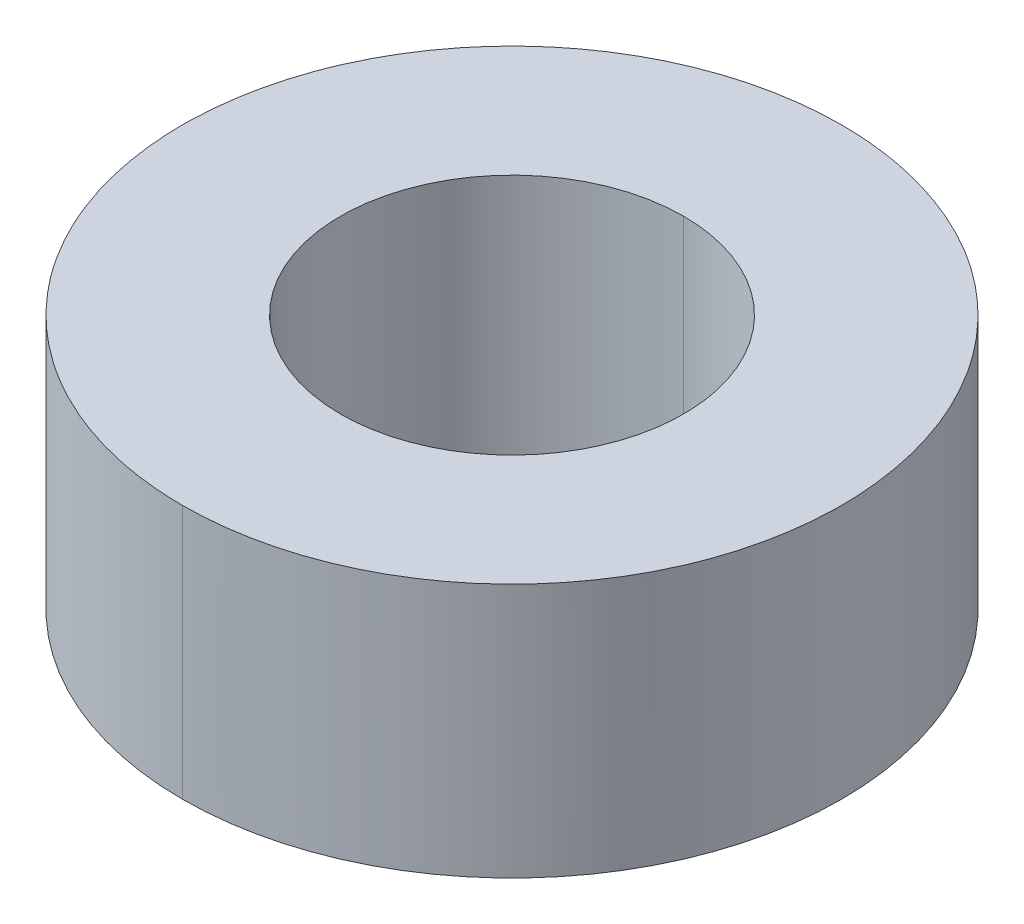
ISO-10303-21;
HEADER;
FILE_DESCRIPTION(('STEP AP214'),'2;1');
FILE_NAME('part.step','',(''),(''),'','','');
FILE_SCHEMA(('AUTOMOTIVE_DESIGN { 1 0 10303 214 1 1 1 1 }'));
ENDSEC;
DATA;
#1=APPLICATION_CONTEXT('core data for automotive mechanical design processes');
#2=APPLICATION_PROTOCOL_DEFINITION('international standard','automotive_design',2000,#1);
#3=PRODUCT_CONTEXT('',#1,'mechanical');
#4=PRODUCT('Part','Part','',(#3));
#5=PRODUCT_RELATED_PRODUCT_CATEGORY('part','',(#4));
#6=PRODUCT_DEFINITION_FORMATION('','',#4);
#7=PRODUCT_DEFINITION_CONTEXT('part definition',#1,'design');
#8=PRODUCT_DEFINITION('design','',#6,#7);
#9=PRODUCT_DEFINITION_SHAPE('','',#8);
#10=(LENGTH_UNIT() NAMED_UNIT(*) SI_UNIT(.MILLI.,.METRE.));
#11=(NAMED_UNIT(*) PLANE_ANGLE_UNIT() SI_UNIT($,.RADIAN.));
#12=(NAMED_UNIT(*) SI_UNIT($,.STERADIAN.) SOLID_ANGLE_UNIT());
#13=UNCERTAINTY_MEASURE_WITH_UNIT(LENGTH_MEASURE(1.E-05),#10,'distance_accuracy_value','');
#14=(GEOMETRIC_REPRESENTATION_CONTEXT(3) GLOBAL_UNCERTAINTY_ASSIGNED_CONTEXT((#13)) GLOBAL_UNIT_ASSIGNED_CONTEXT((#10,
#11,#12)) REPRESENTATION_CONTEXT('',''));
#15=CARTESIAN_POINT('',(0.,0.,0.));
#16=DIRECTION('',(0.,0.,1.));
#17=DIRECTION('',(1.,0.,0.));
#18=AXIS2_PLACEMENT_3D('',#15,#16,#17);
#19=CARTESIAN_POINT('',(0.,2.413,-3.1242));
#20=CARTESIAN_POINT('',(0.,0.,-3.1242));
#21=(BOUNDED_CURVE() B_SPLINE_CURVE(1,(#19,#20),.UNSPECIFIED.,.F.,
.F.) B_SPLINE_CURVE_WITH_KNOTS((2,2),(0.,1.),
.UNSPECIFIED.) CURVE() GEOMETRIC_REPRESENTATION_ITEM() RATIONAL_B_SPLINE_CURVE((1.,1.)) REPRESENTATION_ITEM(''));
#22=CARTESIAN_POINT('',(0.,2.413,0.));
#23=DIRECTION('',(0.,-1.,0.));
#24=AXIS1_PLACEMENT('',#22,#23);
#25=SURFACE_OF_REVOLUTION('',#21,#24);
#26=CARTESIAN_POINT('',(-1.2815682627352E-09,2.413,3.1242));
#27=CARTESIAN_POINT('',(-1.2815682627352E-09,2.31245833333333,3.1242));
#28=CARTESIAN_POINT('',(-1.2815682627352E-09,2.21191666666667,3.1242));
#29=CARTESIAN_POINT('',(-1.2815682627352E-09,2.01083333333333,3.1242));
#30=CARTESIAN_POINT('',(-1.2815682627352E-09,1.91029166666667,3.1242));
#31=CARTESIAN_POINT('',(-1.2815682627352E-09,1.70920833333333,3.1242));
#32=CARTESIAN_POINT('',(-1.2815682627352E-09,1.60866666666667,3.1242));
#33=CARTESIAN_POINT('',(-1.2815682627352E-09,1.40758333333333,3.1242));
#34=CARTESIAN_POINT('',(-1.2815682627352E-09,1.30704166666667,3.1242));
#35=CARTESIAN_POINT('',(-1.2815682627352E-09,1.10595833333333,3.1242));
#36=CARTESIAN_POINT('',(-1.2815682627352E-09,1.00541666666667,3.1242));
#37=CARTESIAN_POINT('',(-1.2815682627352E-09,0.804333333333333,3.1242));
#38=CARTESIAN_POINT('',(-1.2815682627352E-09,0.703791666666667,3.1242));
#39=CARTESIAN_POINT('',(-1.2815682627352E-09,0.502708333333333,3.1242));
#40=CARTESIAN_POINT('',(-1.2815682627352E-09,0.402166666666666,3.1242));
#41=CARTESIAN_POINT('',(-1.2815682627352E-09,0.201083333333333,3.1242));
#42=CARTESIAN_POINT('',(-1.2815682627352E-09,0.100541666666667,3.1242));
#43=CARTESIAN_POINT('',(-1.2815682627352E-09,0.,3.1242));
#44=B_SPLINE_CURVE_WITH_KNOTS('',3,(#26,#27,#28,#29,#30,#31,#32,#33,#34,#35,#36,#37,#38,#39,#40,
#41,#42,#43),.UNSPECIFIED.,.F.,.F.,(4,2,2,2,2,2,2,2,4),(0.,0.301625,0.60325,0.904875,1.2065,
1.508125,1.80975,2.111375,2.413),.UNSPECIFIED.);
#45=CARTESIAN_POINT('',(-8.54378841823463E-10,2.413,3.12419999948346));
#46=VERTEX_POINT('',#45);
#47=CARTESIAN_POINT('',(-8.54378841823463E-10,0.,3.12419999948346));
#48=VERTEX_POINT('',#47);
#49=EDGE_CURVE('E73',#46,#48,#44,.T.);
#50=ORIENTED_EDGE('',*,*,#49,.T.);
#51=CARTESIAN_POINT('',(0.,0.,0.));
#52=DIRECTION('',(0.,1.,0.));
#53=DIRECTION('',(-4.10206857030662E-10,0.,1.));
#54=AXIS2_PLACEMENT_3D('',#51,#52,#53);
#55=CIRCLE('',#54,3.1242);
#56=CARTESIAN_POINT('',(-1.87021244342359E-10,0.,-3.12419999948346));
#57=VERTEX_POINT('',#56);
#58=EDGE_CURVE('E65',#48,#57,#55,.T.);
#59=ORIENTED_EDGE('',*,*,#58,.T.);
#60=CARTESIAN_POINT('',(0.,0.,-3.1242));
#61=CARTESIAN_POINT('',(0.,0.100541666666667,-3.1242));
#62=CARTESIAN_POINT('',(0.,0.201083333333333,-3.1242));
#63=CARTESIAN_POINT('',(0.,0.402166666666667,-3.1242));
#64=CARTESIAN_POINT('',(0.,0.502708333333333,-3.1242));
#65=CARTESIAN_POINT('',(0.,0.703791666666667,-3.1242));
#66=CARTESIAN_POINT('',(0.,0.804333333333333,-3.1242));
#67=CARTESIAN_POINT('',(0.,1.00541666666667,-3.1242));
#68=CARTESIAN_POINT('',(0.,1.10595833333333,-3.1242));
#69=CARTESIAN_POINT('',(0.,1.30704166666667,-3.1242));
#70=CARTESIAN_POINT('',(0.,1.40758333333333,-3.1242));
#71=CARTESIAN_POINT('',(0.,1.60866666666667,-3.1242));
#72=CARTESIAN_POINT('',(0.,1.70920833333333,-3.1242));
#73=CARTESIAN_POINT('',(0.,1.91029166666667,-3.1242));
#74=CARTESIAN_POINT('',(0.,2.01083333333333,-3.1242));
#75=CARTESIAN_POINT('',(0.,2.21191666666667,-3.1242));
#76=CARTESIAN_POINT('',(0.,2.31245833333333,-3.1242));
#77=CARTESIAN_POINT('',(0.,2.413,-3.1242));
#78=B_SPLINE_CURVE_WITH_KNOTS('',3,(#60,#61,#62,#63,#64,#65,#66,#67,#68,#69,#70,#71,#72,#73,#74,
#75,#76,#77),.UNSPECIFIED.,.F.,.F.,(4,2,2,2,2,2,2,2,4),(0.,0.301625,0.60325,0.904875,1.2065,
1.508125,1.80975,2.111375,2.413),.UNSPECIFIED.);
#79=CARTESIAN_POINT('',(-1.87021244342359E-10,2.413,-3.12419999948346));
#80=VERTEX_POINT('',#79);
#81=EDGE_CURVE('E60',#57,#80,#78,.T.);
#82=ORIENTED_EDGE('',*,*,#81,.T.);
#83=CARTESIAN_POINT('',(0.,2.413,3.1241999984504));
#84=CARTESIAN_POINT('',(0.0511813740033214,2.413,3.12420433311254));
#85=CARTESIAN_POINT('',(0.102363470383304,2.413,3.12295455813763));
#86=CARTESIAN_POINT('',(0.204480860862585,2.413,3.11794766369663));
#87=CARTESIAN_POINT('',(0.25541645248393,2.413,3.11419660650222));
#88=CARTESIAN_POINT('',(0.357040984409926,2.413,3.10418807863722));
#89=CARTESIAN_POINT('',(0.407729924715871,2.413,3.09793060797976));
#90=CARTESIAN_POINT('',(0.50886129920721,2.413,3.0829167871321));
#91=CARTESIAN_POINT('',(0.559302839631911,2.413,3.07415442448706));
#92=CARTESIAN_POINT('',(0.659699528360831,2.413,3.05418432523194));
#93=CARTESIAN_POINT('',(0.70965467666352,2.413,3.04297658861417));
#94=CARTESIAN_POINT('',(0.808833346996643,2.413,3.01814608930047));
#95=CARTESIAN_POINT('',(0.858058344501174,2.413,3.00452922398823));
#96=CARTESIAN_POINT('',(0.955777559678571,2.413,2.97488642732154));
#97=CARTESIAN_POINT('',(1.00427177734941,2.413,2.95886049596041));
#98=CARTESIAN_POINT('',(1.1005309072859,2.413,2.92440557441904));
#99=CARTESIAN_POINT('',(1.14829376991575,2.413,2.90597086096556));
#100=CARTESIAN_POINT('',(1.24286538824018,2.413,2.86679801463727));
#101=CARTESIAN_POINT('',(1.28967414392776,2.413,2.84605988174552));
#102=CARTESIAN_POINT('',(1.38210293618829,2.413,2.80235770611908));
#103=CARTESIAN_POINT('',(1.42772557041913,2.413,2.77939915966545));
#104=CARTESIAN_POINT('',(1.51778411557207,2.413,2.73126186383637));
#105=CARTESIAN_POINT('',(1.56222002649728,2.413,2.70608311446673));
#106=CARTESIAN_POINT('',(1.64990774173043,2.413,2.6535110090268));
#107=CARTESIAN_POINT('',(1.69315641923442,2.413,2.62611243952242));
#108=CARTESIAN_POINT('',(1.77826862622103,2.413,2.56924228101411));
#109=CARTESIAN_POINT('',(1.82013215571898,2.413,2.53977069203314));
#110=CARTESIAN_POINT('',(1.90225908283206,2.413,2.47887628102382));
#111=CARTESIAN_POINT('',(1.94252610045515,2.413,2.44745834287905));
#112=CARTESIAN_POINT('',(2.02146307513223,2.413,2.38267644237074));
#113=CARTESIAN_POINT('',(2.06013303218048,2.413,2.34931248000019));
#114=CARTESIAN_POINT('',(2.13587954408556,2.413,2.28064350931128));
#115=CARTESIAN_POINT('',(2.17295201511845,2.413,2.24533399773132));
#116=CARTESIAN_POINT('',(2.24533399773132,2.413,2.17295201511846));
#117=CARTESIAN_POINT('',(2.28064350931129,2.413,2.13587954408555));
#118=CARTESIAN_POINT('',(2.34931248000019,2.413,2.06013303218048));
#119=CARTESIAN_POINT('',(2.3826764423707,2.413,2.02146307513223));
#120=CARTESIAN_POINT('',(2.4474583428791,2.413,1.94252610045514));
#121=CARTESIAN_POINT('',(2.47887628102398,2.413,1.90225908283204));
#122=CARTESIAN_POINT('',(2.53977069203299,2.413,1.82013215571899));
#123=CARTESIAN_POINT('',(2.56924228101352,2.413,1.77826862622109));
#124=CARTESIAN_POINT('',(2.62611243952301,2.413,1.69315641923437));
#125=CARTESIAN_POINT('',(2.65351100902902,2.413,1.64990774173021));
#126=CARTESIAN_POINT('',(2.70608311446452,2.413,1.56222002649748));
#127=CARTESIAN_POINT('',(2.73126186382813,2.413,1.51778411557285));
#128=CARTESIAN_POINT('',(2.77939915967369,2.413,1.42772557041833));
#129=CARTESIAN_POINT('',(2.80235770614983,2.413,1.38210293618533));
#130=CARTESIAN_POINT('',(2.8460598817147,2.413,1.28967414393072));
#131=CARTESIAN_POINT('',(2.86679801452209,2.413,1.24286538825126));
#132=CARTESIAN_POINT('',(2.90597086108074,2.413,1.14829376990467));
#133=CARTESIAN_POINT('',(2.92440557484893,2.413,1.10053090724454));
#134=CARTESIAN_POINT('',(2.95886049553156,2.413,1.00427177739066));
#135=CARTESIAN_POINT('',(2.97488642572284,2.413,0.955777559832361));
#136=CARTESIAN_POINT('',(3.00452922558694,2.413,0.858058344347375));
#137=CARTESIAN_POINT('',(3.01814609526645,2.413,0.808833346422715));
#138=CARTESIAN_POINT('',(3.04297658263375,2.413,0.709654677238831));
#139=CARTESIAN_POINT('',(3.05418430288776,2.413,0.659699530510328));
#140=CARTESIAN_POINT('',(3.07415444683124,2.413,0.55930283748241));
#141=CARTESIAN_POINT('',(3.0829168705284,2.413,0.508861291184524));
#142=CARTESIAN_POINT('',(3.09793052478486,2.413,0.407729932719174));
#143=CARTESIAN_POINT('',(3.1041877684958,2.413,0.35704101424537));
#144=CARTESIAN_POINT('',(3.11419691664365,2.413,0.255416422648471));
#145=CARTESIAN_POINT('',(3.11794882106742,2.413,0.204480749524084));
#146=CARTESIAN_POINT('',(3.12295339796514,2.413,0.102363581991315));
#147=CARTESIAN_POINT('',(3.1241999984504,2.413,0.0511817909956573));
#148=CARTESIAN_POINT('',(3.1241999984504,2.413,-0.051181790995662));
#149=CARTESIAN_POINT('',(3.12295339796514,2.413,-0.102363581991324));
#150=CARTESIAN_POINT('',(3.11794882106742,2.413,-0.204480749524097));
#151=CARTESIAN_POINT('',(3.11419691664365,2.413,-0.255416422648484));
#152=CARTESIAN_POINT('',(3.10418776849579,2.413,-0.357041014245379));
#153=CARTESIAN_POINT('',(3.09793052478486,2.413,-0.407729932719182));
#154=CARTESIAN_POINT('',(3.0829168705284,2.413,-0.508861291184528));
#155=CARTESIAN_POINT('',(3.07415444683124,2.413,-0.559302837482412));
#156=CARTESIAN_POINT('',(3.05418430288776,2.413,-0.659699530510331));
#157=CARTESIAN_POINT('',(3.04297658263375,2.413,-0.709654677238835));
#158=CARTESIAN_POINT('',(3.01814609526645,2.413,-0.808833346422721));
#159=CARTESIAN_POINT('',(3.00452922558694,2.413,-0.858058344347381));
#160=CARTESIAN_POINT('',(2.97488642572283,2.413,-0.955777559832368));
#161=CARTESIAN_POINT('',(2.95886049553156,2.413,-1.00427177739067));
#162=CARTESIAN_POINT('',(2.92440557484893,2.413,-1.10053090724455));
#163=CARTESIAN_POINT('',(2.90597086108074,2.413,-1.14829376990467));
#164=CARTESIAN_POINT('',(2.86679801452209,2.413,-1.24286538825126));
#165=CARTESIAN_POINT('',(2.84605988171469,2.413,-1.28967414393073));
#166=CARTESIAN_POINT('',(2.80235770614983,2.413,-1.38210293618534));
#167=CARTESIAN_POINT('',(2.77939915967369,2.413,-1.42772557041834));
#168=CARTESIAN_POINT('',(2.73126186382813,2.413,-1.51778411557286));
#169=CARTESIAN_POINT('',(2.70608311446452,2.413,-1.56222002649749));
#170=CARTESIAN_POINT('',(2.65351100902902,2.413,-1.64990774173021));
#171=CARTESIAN_POINT('',(2.62611243952301,2.413,-1.69315641923437));
#172=CARTESIAN_POINT('',(2.56924228101352,2.413,-1.77826862622109));
#173=CARTESIAN_POINT('',(2.53977069203298,2.413,-1.82013215571899));
#174=CARTESIAN_POINT('',(2.47887628102398,2.413,-1.90225908283204));
#175=CARTESIAN_POINT('',(2.4474583428791,2.413,-1.94252610045515));
#176=CARTESIAN_POINT('',(2.3826764423707,2.413,-2.02146307513224));
#177=CARTESIAN_POINT('',(2.34931248000018,2.413,-2.06013303218049));
#178=CARTESIAN_POINT('',(2.28064350931129,2.413,-2.13587954408556));
#179=CARTESIAN_POINT('',(2.24533399773132,2.413,-2.17295201511846));
#180=CARTESIAN_POINT('',(2.17295201511845,2.413,-2.24533399773132));
#181=CARTESIAN_POINT('',(2.13587954408555,2.413,-2.28064350931128));
#182=CARTESIAN_POINT('',(2.06013303218048,2.413,-2.3493124800002));
#183=CARTESIAN_POINT('',(2.02146307513223,2.413,-2.38267644237075));
#184=CARTESIAN_POINT('',(1.94252610045514,2.413,-2.44745834287906));
#185=CARTESIAN_POINT('',(1.90225908283205,2.413,-2.47887628102382));
#186=CARTESIAN_POINT('',(1.82013215571897,2.413,-2.53977069203315));
#187=CARTESIAN_POINT('',(1.77826862622103,2.413,-2.56924228101411));
#188=CARTESIAN_POINT('',(1.69315641923442,2.413,-2.62611243952242));
#189=CARTESIAN_POINT('',(1.64990774173042,2.413,-2.6535110090268));
#190=CARTESIAN_POINT('',(1.56222002649727,2.413,-2.70608311446673));
#191=CARTESIAN_POINT('',(1.51778411557206,2.413,-2.73126186383637));
#192=CARTESIAN_POINT('',(1.42772557041912,2.413,-2.77939915966545));
#193=CARTESIAN_POINT('',(1.38210293618829,2.413,-2.80235770611908));
#194=CARTESIAN_POINT('',(1.28967414392775,2.413,-2.84605988174553));
#195=CARTESIAN_POINT('',(1.24286538824018,2.413,-2.86679801463727));
#196=CARTESIAN_POINT('',(1.14829376991574,2.413,-2.90597086096556));
#197=CARTESIAN_POINT('',(1.10053090728589,2.413,-2.92440557441904));
#198=CARTESIAN_POINT('',(1.0042717773494,2.413,-2.95886049596041));
#199=CARTESIAN_POINT('',(0.955777559678564,2.413,-2.97488642732154));
#200=CARTESIAN_POINT('',(0.858058344501167,2.413,-3.00452922398823));
#201=CARTESIAN_POINT('',(0.808833346996635,2.413,-3.01814608930047));
#202=CARTESIAN_POINT('',(0.709654676663514,2.413,-3.04297658861417));
#203=CARTESIAN_POINT('',(0.659699528360828,2.413,-3.05418432523194));
#204=CARTESIAN_POINT('',(0.559302839631908,2.413,-3.07415442448706));
#205=CARTESIAN_POINT('',(0.508861299207205,2.413,-3.0829167871321));
#206=CARTESIAN_POINT('',(0.407729924715864,2.413,-3.09793060797977));
#207=CARTESIAN_POINT('',(0.35704098440992,2.413,-3.10418807863722));
#208=CARTESIAN_POINT('',(0.255416452483925,2.413,-3.11419660650222));
#209=CARTESIAN_POINT('',(0.204480860862581,2.413,-3.11794766369663));
#210=CARTESIAN_POINT('',(0.102363470383302,2.413,-3.12295455813763));
#211=CARTESIAN_POINT('',(0.0511813740033204,2.413,-3.12420433311254));
#212=CARTESIAN_POINT('',(0.,2.413,-3.1241999984504));
#213=B_SPLINE_CURVE_WITH_KNOTS('',3,(#83,#84,#85,#86,#87,#88,#89,#90,#91,#92,#93,#94,#95,#96,
#97,#98,#99,#100,#101,#102,#103,#104,#105,#106,#107,#108,#109,#110,#111,#112,#113,#114,#115,
#116,#117,#118,#119,#120,#121,#122,#123,#124,#125,#126,#127,#128,#129,#130,#131,#132,#133,#134,
#135,#136,#137,#138,#139,#140,#141,#142,#143,#144,#145,#146,#147,#148,#149,#150,#151,#152,#153,
#154,#155,#156,#157,#158,#159,#160,#161,#162,#163,#164,#165,#166,#167,#168,#169,#170,#171,#172,
#173,#174,#175,#176,#177,#178,#179,#180,#181,#182,#183,#184,#185,#186,#187,#188,#189,#190,#191,
#192,#193,#194,#195,#196,#197,#198,#199,#200,#201,#202,#203,#204,#205,#206,#207,#208,#209,#210,
#211,#212),.UNSPECIFIED.,.F.,.F.,(4,2,2,2,2,2,2,2,2,2,2,2,2,2,2,2,2,2,2,2,2,2,2,2,2,2,2,2,2,2,2,
2,2,2,2,2,2,2,2,2,2,2,2,2,2,2,2,2,2,2,2,2,2,2,2,2,2,2,2,2,2,2,2,2,4),(0.,0.15352974186852,
0.306688724939499,0.459847707207356,0.613377446672332,0.766907186620249,0.920066169055423,
1.07322515191587,1.22675489313653,1.38028463548535,1.5334436193906,1.68660260289513,
1.84013234404469,1.99366208349423,2.14682106542772,2.29998004791152,2.45350978900797,
2.60703953010444,2.76019851258823,2.91335749452173,3.06688723397126,3.22041697512082,
3.37357595862535,3.52673494253061,3.68026468487942,3.83379442610008,3.98695340896053,
4.1401123913957,4.29364213134362,4.4471718708086,4.60033085307646,4.75348983614744,
4.90701957801595,5.06054931988448,5.21370830295545,5.36686728522331,5.52039702468828,
5.6739267646362,5.82708574707138,5.98024472993183,6.13377447115248,6.2873042135013,
6.44046319740655,6.59362218091108,6.74715192206064,6.90068166151018,7.05384064344367,
7.20699962592747,7.36052936702393,7.51405910812039,7.66721809060419,7.82037707253768,
7.97390681198721,8.12743655313678,8.28059553664131,8.43375452054656,8.58728426289537,
8.74081400411604,8.89397298697648,9.04713196941166,9.20066170935957,9.35419144882455,
9.50735043109241,9.66050941416338,9.8140391560319),.UNSPECIFIED.);
#214=EDGE_CURVE('E64',#46,#80,#213,.T.);
#215=ORIENTED_EDGE('',*,*,#214,.F.);
#216=EDGE_LOOP('',(#50,#59,#82,#215));
#217=FACE_BOUND('',#216,.T.);
#218=ADVANCED_FACE('F17',(#217),#25,.T.);
#219=CARTESIAN_POINT('',(0.,2.413,-3.1242));
#220=CARTESIAN_POINT('',(0.,0.,-3.1242));
#221=(BOUNDED_CURVE() B_SPLINE_CURVE(1,(#219,#220),.UNSPECIFIED.,.F.,
.F.) B_SPLINE_CURVE_WITH_KNOTS((2,2),(0.,1.),
.UNSPECIFIED.) CURVE() GEOMETRIC_REPRESENTATION_ITEM() RATIONAL_B_SPLINE_CURVE((1.,1.)) REPRESENTATION_ITEM(''));
#222=CARTESIAN_POINT('',(0.,2.413,0.));
#223=DIRECTION('',(0.,-1.,0.));
#224=AXIS1_PLACEMENT('',#222,#223);
#225=SURFACE_OF_REVOLUTION('',#221,#224);
#226=CARTESIAN_POINT('',(0.,2.413,-3.1241999984504));
#227=CARTESIAN_POINT('',(-0.0511813740033213,2.413,-3.12420433311254));
#228=CARTESIAN_POINT('',(-0.102363470383304,2.413,-3.12295455813763));
#229=CARTESIAN_POINT('',(-0.204480860862585,2.413,-3.11794766369663));
#230=CARTESIAN_POINT('',(-0.255416452483929,2.413,-3.11419660650222));
#231=CARTESIAN_POINT('',(-0.357040984409926,2.413,-3.10418807863722));
#232=CARTESIAN_POINT('',(-0.407729924715872,2.413,-3.09793060797977));
#233=CARTESIAN_POINT('',(-0.508861299207211,2.413,-3.0829167871321));
#234=CARTESIAN_POINT('',(-0.559302839631911,2.413,-3.07415442448706));
#235=CARTESIAN_POINT('',(-0.659699528360831,2.413,-3.05418432523194));
#236=CARTESIAN_POINT('',(-0.70965467666352,2.413,-3.04297658861417));
#237=CARTESIAN_POINT('',(-0.808833346996644,2.413,-3.01814608930047));
#238=CARTESIAN_POINT('',(-0.858058344501174,2.413,-3.00452922398823));
#239=CARTESIAN_POINT('',(-0.955777559678571,2.413,-2.97488642732154));
#240=CARTESIAN_POINT('',(-1.00427177734941,2.413,-2.95886049596041));
#241=CARTESIAN_POINT('',(-1.1005309072859,2.413,-2.92440557441904));
#242=CARTESIAN_POINT('',(-1.14829376991575,2.413,-2.90597086096556));
#243=CARTESIAN_POINT('',(-1.24286538824018,2.413,-2.86679801463727));
#244=CARTESIAN_POINT('',(-1.28967414392776,2.413,-2.84605988174552));
#245=CARTESIAN_POINT('',(-1.38210293618829,2.413,-2.80235770611908));
#246=CARTESIAN_POINT('',(-1.42772557041913,2.413,-2.77939915966545));
#247=CARTESIAN_POINT('',(-1.51778411557207,2.413,-2.73126186383637));
#248=CARTESIAN_POINT('',(-1.56222002649728,2.413,-2.70608311446673));
#249=CARTESIAN_POINT('',(-1.64990774173043,2.413,-2.6535110090268));
#250=CARTESIAN_POINT('',(-1.69315641923443,2.413,-2.62611243952242));
#251=CARTESIAN_POINT('',(-1.77826862622103,2.413,-2.56924228101411));
#252=CARTESIAN_POINT('',(-1.82013215571898,2.413,-2.53977069203314));
#253=CARTESIAN_POINT('',(-1.90225908283206,2.413,-2.47887628102382));
#254=CARTESIAN_POINT('',(-1.94252610045515,2.413,-2.44745834287905));
#255=CARTESIAN_POINT('',(-2.02146307513223,2.413,-2.38267644237074));
#256=CARTESIAN_POINT('',(-2.06013303218049,2.413,-2.34931248000019));
#257=CARTESIAN_POINT('',(-2.13587954408556,2.413,-2.28064350931128));
#258=CARTESIAN_POINT('',(-2.17295201511845,2.413,-2.24533399773132));
#259=CARTESIAN_POINT('',(-2.24533399773132,2.413,-2.17295201511845));
#260=CARTESIAN_POINT('',(-2.28064350931129,2.413,-2.13587954408555));
#261=CARTESIAN_POINT('',(-2.34931248000019,2.413,-2.06013303218048));
#262=CARTESIAN_POINT('',(-2.3826764423707,2.413,-2.02146307513223));
#263=CARTESIAN_POINT('',(-2.4474583428791,2.413,-1.94252610045514));
#264=CARTESIAN_POINT('',(-2.47887628102398,2.413,-1.90225908283204));
#265=CARTESIAN_POINT('',(-2.53977069203299,2.413,-1.82013215571899));
#266=CARTESIAN_POINT('',(-2.56924228101352,2.413,-1.77826862622109));
#267=CARTESIAN_POINT('',(-2.62611243952301,2.413,-1.69315641923437));
#268=CARTESIAN_POINT('',(-2.65351100902902,2.413,-1.64990774173021));
#269=CARTESIAN_POINT('',(-2.70608311446452,2.413,-1.56222002649749));
#270=CARTESIAN_POINT('',(-2.73126186382813,2.413,-1.51778411557285));
#271=CARTESIAN_POINT('',(-2.77939915967369,2.413,-1.42772557041833));
#272=CARTESIAN_POINT('',(-2.80235770614983,2.413,-1.38210293618533));
#273=CARTESIAN_POINT('',(-2.8460598817147,2.413,-1.28967414393072));
#274=CARTESIAN_POINT('',(-2.86679801452209,2.413,-1.24286538825126));
#275=CARTESIAN_POINT('',(-2.90597086108074,2.413,-1.14829376990467));
#276=CARTESIAN_POINT('',(-2.92440557484893,2.413,-1.10053090724454));
#277=CARTESIAN_POINT('',(-2.95886049553156,2.413,-1.00427177739066));
#278=CARTESIAN_POINT('',(-2.97488642572284,2.413,-0.955777559832361));
#279=CARTESIAN_POINT('',(-3.00452922558694,2.413,-0.858058344347375));
#280=CARTESIAN_POINT('',(-3.01814609526645,2.413,-0.808833346422715));
#281=CARTESIAN_POINT('',(-3.04297658263375,2.413,-0.709654677238831));
#282=CARTESIAN_POINT('',(-3.05418430288776,2.413,-0.659699530510328));
#283=CARTESIAN_POINT('',(-3.07415444683124,2.413,-0.55930283748241));
#284=CARTESIAN_POINT('',(-3.0829168705284,2.413,-0.508861291184524));
#285=CARTESIAN_POINT('',(-3.09793052478486,2.413,-0.407729932719174));
#286=CARTESIAN_POINT('',(-3.1041877684958,2.413,-0.35704101424537));
#287=CARTESIAN_POINT('',(-3.11419691664365,2.413,-0.255416422648471));
#288=CARTESIAN_POINT('',(-3.11794882106742,2.413,-0.204480749524084));
#289=CARTESIAN_POINT('',(-3.12295339796514,2.413,-0.102363581991315));
#290=CARTESIAN_POINT('',(-3.1241999984504,2.413,-0.0511817909956573));
#291=CARTESIAN_POINT('',(-3.1241999984504,2.413,0.0511817909956616));
#292=CARTESIAN_POINT('',(-3.12295339796514,2.413,0.102363581991323));
#293=CARTESIAN_POINT('',(-3.11794882106742,2.413,0.204480749524096));
#294=CARTESIAN_POINT('',(-3.11419691664365,2.413,0.255416422648482));
#295=CARTESIAN_POINT('',(-3.10418776849579,2.413,0.357041014245379));
#296=CARTESIAN_POINT('',(-3.09793052478486,2.413,0.407729932719182));
#297=CARTESIAN_POINT('',(-3.0829168705284,2.413,0.508861291184529));
#298=CARTESIAN_POINT('',(-3.07415444683124,2.413,0.559302837482412));
#299=CARTESIAN_POINT('',(-3.05418430288776,2.413,0.65969953051033));
#300=CARTESIAN_POINT('',(-3.04297658263375,2.413,0.709654677238834));
#301=CARTESIAN_POINT('',(-3.01814609526645,2.413,0.80883334642272));
#302=CARTESIAN_POINT('',(-3.00452922558694,2.413,0.858058344347381));
#303=CARTESIAN_POINT('',(-2.97488642572284,2.413,0.955777559832368));
#304=CARTESIAN_POINT('',(-2.95886049553156,2.413,1.00427177739067));
#305=CARTESIAN_POINT('',(-2.92440557484893,2.413,1.10053090724455));
#306=CARTESIAN_POINT('',(-2.90597086108074,2.413,1.14829376990467));
#307=CARTESIAN_POINT('',(-2.86679801452209,2.413,1.24286538825126));
#308=CARTESIAN_POINT('',(-2.8460598817147,2.413,1.28967414393073));
#309=CARTESIAN_POINT('',(-2.80235770614983,2.413,1.38210293618534));
#310=CARTESIAN_POINT('',(-2.77939915967369,2.413,1.42772557041834));
#311=CARTESIAN_POINT('',(-2.73126186382813,2.413,1.51778411557286));
#312=CARTESIAN_POINT('',(-2.70608311446452,2.413,1.56222002649749));
#313=CARTESIAN_POINT('',(-2.65351100902902,2.413,1.64990774173021));
#314=CARTESIAN_POINT('',(-2.62611243952301,2.413,1.69315641923437));
#315=CARTESIAN_POINT('',(-2.56924228101352,2.413,1.77826862622109));
#316=CARTESIAN_POINT('',(-2.53977069203298,2.413,1.82013215571899));
#317=CARTESIAN_POINT('',(-2.47887628102398,2.413,1.90225908283204));
#318=CARTESIAN_POINT('',(-2.4474583428791,2.413,1.94252610045515));
#319=CARTESIAN_POINT('',(-2.3826764423707,2.413,2.02146307513224));
#320=CARTESIAN_POINT('',(-2.34931248000018,2.413,2.06013303218048));
#321=CARTESIAN_POINT('',(-2.28064350931129,2.413,2.13587954408556));
#322=CARTESIAN_POINT('',(-2.24533399773132,2.413,2.17295201511846));
#323=CARTESIAN_POINT('',(-2.17295201511845,2.413,2.24533399773132));
#324=CARTESIAN_POINT('',(-2.13587954408555,2.413,2.28064350931128));
#325=CARTESIAN_POINT('',(-2.06013303218048,2.413,2.3493124800002));
#326=CARTESIAN_POINT('',(-2.02146307513223,2.413,2.38267644237075));
#327=CARTESIAN_POINT('',(-1.94252610045514,2.413,2.44745834287906));
#328=CARTESIAN_POINT('',(-1.90225908283205,2.413,2.47887628102382));
#329=CARTESIAN_POINT('',(-1.82013215571897,2.413,2.53977069203315));
#330=CARTESIAN_POINT('',(-1.77826862622103,2.413,2.56924228101411));
#331=CARTESIAN_POINT('',(-1.69315641923442,2.413,2.62611243952242));
#332=CARTESIAN_POINT('',(-1.64990774173042,2.413,2.6535110090268));
#333=CARTESIAN_POINT('',(-1.56222002649727,2.413,2.70608311446673));
#334=CARTESIAN_POINT('',(-1.51778411557206,2.413,2.73126186383637));
#335=CARTESIAN_POINT('',(-1.42772557041912,2.413,2.77939915966545));
#336=CARTESIAN_POINT('',(-1.38210293618829,2.413,2.80235770611908));
#337=CARTESIAN_POINT('',(-1.28967414392775,2.413,2.84605988174553));
#338=CARTESIAN_POINT('',(-1.24286538824018,2.413,2.86679801463727));
#339=CARTESIAN_POINT('',(-1.14829376991575,2.413,2.90597086096556));
#340=CARTESIAN_POINT('',(-1.1005309072859,2.413,2.92440557441904));
#341=CARTESIAN_POINT('',(-1.0042717773494,2.413,2.95886049596041));
#342=CARTESIAN_POINT('',(-0.955777559678565,2.413,2.97488642732155));
#343=CARTESIAN_POINT('',(-0.858058344501167,2.413,3.00452922398823));
#344=CARTESIAN_POINT('',(-0.808833346996635,2.413,3.01814608930047));
#345=CARTESIAN_POINT('',(-0.709654676663514,2.413,3.04297658861417));
#346=CARTESIAN_POINT('',(-0.659699528360828,2.413,3.05418432523194));
#347=CARTESIAN_POINT('',(-0.559302839631908,2.413,3.07415442448706));
#348=CARTESIAN_POINT('',(-0.508861299207205,2.413,3.0829167871321));
#349=CARTESIAN_POINT('',(-0.407729924715864,2.413,3.09793060797977));
#350=CARTESIAN_POINT('',(-0.35704098440992,2.413,3.10418807863722));
#351=CARTESIAN_POINT('',(-0.255416452483925,2.413,3.11419660650222));
#352=CARTESIAN_POINT('',(-0.204480860862581,2.413,3.11794766369663));
#353=CARTESIAN_POINT('',(-0.102363470383302,2.413,3.12295455813763));
#354=CARTESIAN_POINT('',(-0.0511813740033203,2.413,3.12420433311254));
#355=CARTESIAN_POINT('',(0.,2.413,3.1241999984504));
#356=B_SPLINE_CURVE_WITH_KNOTS('',3,(#226,#227,#228,#229,#230,#231,#232,#233,#234,#235,#236,
#237,#238,#239,#240,#241,#242,#243,#244,#245,#246,#247,#248,#249,#250,#251,#252,#253,#254,#255,
#256,#257,#258,#259,#260,#261,#262,#263,#264,#265,#266,#267,#268,#269,#270,#271,#272,#273,#274,
#275,#276,#277,#278,#279,#280,#281,#282,#283,#284,#285,#286,#287,#288,#289,#290,#291,#292,#293,
#294,#295,#296,#297,#298,#299,#300,#301,#302,#303,#304,#305,#306,#307,#308,#309,#310,#311,#312,
#313,#314,#315,#316,#317,#318,#319,#320,#321,#322,#323,#324,#325,#326,#327,#328,#329,#330,#331,
#332,#333,#334,#335,#336,#337,#338,#339,#340,#341,#342,#343,#344,#345,#346,#347,#348,#349,#350,
#351,#352,#353,#354,#355),.UNSPECIFIED.,.F.,.F.,(4,2,2,2,2,2,2,2,2,2,2,2,2,2,2,2,2,2,2,2,2,2,2,
2,2,2,2,2,2,2,2,2,2,2,2,2,2,2,2,2,2,2,2,2,2,2,2,2,2,2,2,2,2,2,2,2,2,2,2,2,2,2,2,2,4),(0.,
0.153529741868519,0.306688724939498,0.459847707207357,0.613377446672332,0.76690718662025,
0.920066169055423,1.07322515191587,1.22675489313653,1.38028463548535,1.5334436193906,
1.68660260289513,1.84013234404469,1.99366208349423,2.14682106542772,2.29998004791152,
2.45350978900797,2.60703953010444,2.76019851258823,2.91335749452173,3.06688723397126,
3.22041697512082,3.37357595862535,3.52673494253061,3.68026468487942,3.83379442610008,
3.98695340896053,4.1401123913957,4.29364213134362,4.4471718708086,4.60033085307646,
4.75348983614744,4.90701957801595,5.06054931988447,5.21370830295545,5.36686728522331,
5.52039702468828,5.6739267646362,5.82708574707137,5.98024472993182,6.13377447115248,
6.2873042135013,6.44046319740655,6.59362218091108,6.74715192206064,6.90068166151017,
7.05384064344367,7.20699962592747,7.36052936702392,7.51405910812039,7.66721809060419,
7.82037707253768,7.97390681198721,8.12743655313678,8.28059553664131,8.43375452054656,
8.58728426289537,8.74081400411603,8.89397298697648,9.04713196941166,9.20066170935957,
9.35419144882455,9.50735043109241,9.66050941416338,9.8140391560319),.UNSPECIFIED.);
#357=EDGE_CURVE('E79',#80,#46,#356,.T.);
#358=ORIENTED_EDGE('',*,*,#357,.F.);
#359=ORIENTED_EDGE('',*,*,#81,.F.);
#360=CARTESIAN_POINT('',(0.,0.,0.));
#361=DIRECTION('',(0.,1.,0.));
#362=DIRECTION('',(-1.79586368679046E-10,0.,-1.));
#363=AXIS2_PLACEMENT_3D('',#360,#361,#362);
#364=CIRCLE('',#363,3.1242);
#365=EDGE_CURVE('E123',#57,#48,#364,.T.);
#366=ORIENTED_EDGE('',*,*,#365,.T.);
#367=ORIENTED_EDGE('',*,*,#49,.F.);
#368=EDGE_LOOP('',(#358,#359,#366,#367));
#369=FACE_BOUND('',#368,.T.);
#370=ADVANCED_FACE('F86',(#369),#225,.T.);
#371=CARTESIAN_POINT('',(0.,2.413,-1.6256));
#372=CARTESIAN_POINT('',(0.,0.,-1.6256));
#373=(BOUNDED_CURVE() B_SPLINE_CURVE(1,(#371,#372),.UNSPECIFIED.,.F.,
.F.) B_SPLINE_CURVE_WITH_KNOTS((2,2),(0.,1.),
.UNSPECIFIED.) CURVE() GEOMETRIC_REPRESENTATION_ITEM() RATIONAL_B_SPLINE_CURVE((1.,1.)) REPRESENTATION_ITEM(''));
#374=CARTESIAN_POINT('',(0.,2.413,0.));
#375=DIRECTION('',(0.,-1.,0.));
#376=AXIS1_PLACEMENT('',#374,#375);
#377=SURFACE_OF_REVOLUTION('',#373,#376);
#378=CARTESIAN_POINT('',(0.,2.413,-1.6256));
#379=CARTESIAN_POINT('',(0.,2.31245833333333,-1.6256));
#380=CARTESIAN_POINT('',(0.,2.21191666666667,-1.6256));
#381=CARTESIAN_POINT('',(0.,2.01083333333333,-1.6256));
#382=CARTESIAN_POINT('',(0.,1.91029166666667,-1.6256));
#383=CARTESIAN_POINT('',(0.,1.70920833333333,-1.6256));
#384=CARTESIAN_POINT('',(0.,1.60866666666667,-1.6256));
#385=CARTESIAN_POINT('',(0.,1.40758333333333,-1.6256));
#386=CARTESIAN_POINT('',(0.,1.30704166666667,-1.6256));
#387=CARTESIAN_POINT('',(0.,1.10595833333333,-1.6256));
#388=CARTESIAN_POINT('',(0.,1.00541666666667,-1.6256));
#389=CARTESIAN_POINT('',(0.,0.804333333333333,-1.6256));
#390=CARTESIAN_POINT('',(0.,0.703791666666667,-1.6256));
#391=CARTESIAN_POINT('',(0.,0.502708333333333,-1.6256));
#392=CARTESIAN_POINT('',(0.,0.402166666666667,-1.6256));
#393=CARTESIAN_POINT('',(0.,0.201083333333333,-1.6256));
#394=CARTESIAN_POINT('',(0.,0.100541666666667,-1.6256));
#395=CARTESIAN_POINT('',(0.,0.,-1.6256));
#396=B_SPLINE_CURVE_WITH_KNOTS('',3,(#378,#379,#380,#381,#382,#383,#384,#385,#386,#387,#388,
#389,#390,#391,#392,#393,#394,#395),.UNSPECIFIED.,.F.,.F.,(4,2,2,2,2,2,2,2,4),(0.,0.301625,
0.60325,0.904875,1.2065,1.508125,1.80975,2.111375,2.413),.UNSPECIFIED.);
#397=CARTESIAN_POINT('',(-9.73118669748859E-11,2.413,-1.62560000086225));
#398=VERTEX_POINT('',#397);
#399=CARTESIAN_POINT('',(-9.73118669748859E-11,0.,-1.62560000086225));
#400=VERTEX_POINT('',#399);
#401=EDGE_CURVE('E38',#398,#400,#396,.T.);
#402=ORIENTED_EDGE('',*,*,#401,.T.);
#403=CARTESIAN_POINT('',(0.,0.,0.));
#404=DIRECTION('',(0.,-1.,0.));
#405=DIRECTION('',(0.,0.,-1.));
#406=AXIS2_PLACEMENT_3D('',#403,#404,#405);
#407=CIRCLE('',#406,1.6256);
#408=CARTESIAN_POINT('',(-4.4455484452603E-10,0.,1.62560000086225));
#409=VERTEX_POINT('',#408);
#410=EDGE_CURVE('E134',#400,#409,#407,.T.);
#411=ORIENTED_EDGE('',*,*,#410,.T.);
#412=CARTESIAN_POINT('',(-6.66832266789045E-10,0.,1.6256));
#413=CARTESIAN_POINT('',(-6.66832266789045E-10,0.100541666666666,1.6256));
#414=CARTESIAN_POINT('',(-6.66832266789045E-10,0.201083333333333,1.6256));
#415=CARTESIAN_POINT('',(-6.66832266789045E-10,0.402166666666666,1.6256));
#416=CARTESIAN_POINT('',(-6.66832266789045E-10,0.502708333333333,1.6256));
#417=CARTESIAN_POINT('',(-6.66832266789045E-10,0.703791666666667,1.6256));
#418=CARTESIAN_POINT('',(-6.66832266789045E-10,0.804333333333333,1.6256));
#419=CARTESIAN_POINT('',(-6.66832266789045E-10,1.00541666666667,1.6256));
#420=CARTESIAN_POINT('',(-6.66832266789045E-10,1.10595833333333,1.6256));
#421=CARTESIAN_POINT('',(-6.66832266789045E-10,1.30704166666667,1.6256));
#422=CARTESIAN_POINT('',(-6.66832266789045E-10,1.40758333333333,1.6256));
#423=CARTESIAN_POINT('',(-6.66832266789045E-10,1.60866666666667,1.6256));
#424=CARTESIAN_POINT('',(-6.66832266789045E-10,1.70920833333333,1.6256));
#425=CARTESIAN_POINT('',(-6.66832266789045E-10,1.91029166666667,1.6256));
#426=CARTESIAN_POINT('',(-6.66832266789045E-10,2.01083333333333,1.6256));
#427=CARTESIAN_POINT('',(-6.66832266789045E-10,2.21191666666667,1.6256));
#428=CARTESIAN_POINT('',(-6.66832266789045E-10,2.31245833333333,1.6256));
#429=CARTESIAN_POINT('',(-6.66832266789045E-10,2.413,1.6256));
#430=B_SPLINE_CURVE_WITH_KNOTS('',3,(#412,#413,#414,#415,#416,#417,#418,#419,#420,#421,#422,
#423,#424,#425,#426,#427,#428,#429),.UNSPECIFIED.,.F.,.F.,(4,2,2,2,2,2,2,2,4),(0.,0.301625,
0.60325,0.904875,1.2065,1.508125,1.80975,2.111375,2.413),.UNSPECIFIED.);
#431=CARTESIAN_POINT('',(-4.4455484452603E-10,2.413,1.62560000086225));
#432=VERTEX_POINT('',#431);
#433=EDGE_CURVE('E155',#409,#432,#430,.T.);
#434=ORIENTED_EDGE('',*,*,#433,.T.);
#435=CARTESIAN_POINT('',(0.,2.413,-1.62560000258674));
#436=CARTESIAN_POINT('',(0.0266309582651086,2.413,-1.62560225807966));
#437=CARTESIAN_POINT('',(0.0532622923801896,2.413,-1.62495196850109));
#438=CARTESIAN_POINT('',(0.106396543436568,2.413,-1.62234675457769));
#439=CARTESIAN_POINT('',(0.132899615185431,2.413,-1.62039498457166));
#440=CARTESIAN_POINT('',(0.185777420095964,2.413,-1.61518729439577));
#441=CARTESIAN_POINT('',(0.212152153256761,2.413,-1.61193137421702));
#442=CARTESIAN_POINT('',(0.264773356356953,2.413,-1.60411930293917));
#443=CARTESIAN_POINT('',(0.291019361247154,2.413,-1.59956002338958));
#444=CARTESIAN_POINT('',(0.34325828927268,2.413,-1.58916907704516));
#445=CARTESIAN_POINT('',(0.369251212408713,2.413,-1.58333741025388));
#446=CARTESIAN_POINT('',(0.420856374865652,2.413,-1.57041747667496));
#447=CARTESIAN_POINT('',(0.446469381913684,2.413,-1.56333227844835));
#448=CARTESIAN_POINT('',(0.497315152829686,2.413,-1.54790838418069));
#449=CARTESIAN_POINT('',(0.522547916696505,2.413,-1.53956968813586));
#450=CARTESIAN_POINT('',(0.572633968244703,2.413,-1.52164192336145));
#451=CARTESIAN_POINT('',(0.597486189447738,2.413,-1.51204987666541));
#452=CARTESIAN_POINT('',(0.646694186057729,2.413,-1.49166725690007));
#453=CARTESIAN_POINT('',(0.671049961464865,2.413,-1.4808766838312));
#454=CARTESIAN_POINT('',(0.719142991702021,2.413,-1.45813734065813));
#455=CARTESIAN_POINT('',(0.74288159816014,2.413,-1.44619143041023));
#456=CARTESIAN_POINT('',(0.789741329006422,2.413,-1.42114438248722));
#457=CARTESIAN_POINT('',(0.812862453397782,2.413,-1.40804324481809));
#458=CARTESIAN_POINT('',(0.858488581785783,2.413,-1.38068865409522));
#459=CARTESIAN_POINT('',(0.880991958829943,2.413,-1.36643248836421));
#460=CARTESIAN_POINT('',(0.925277985235872,2.413,-1.33684151183304));
#461=CARTESIAN_POINT('',(0.9470606346,2.413,-1.32150670103641));
#462=CARTESIAN_POINT('',(0.989793344260929,2.413,-1.28982180376717));
#463=CARTESIAN_POINT('',(1.01074528814208,2.413,-1.27347425850618));
#464=CARTESIAN_POINT('',(1.05181818496194,2.413,-1.23976660256283));
#465=CARTESIAN_POINT('',(1.07193913790025,2.413,-1.22240649187999));
#466=CARTESIAN_POINT('',(1.11135195578969,2.413,-1.18667629485785));
#467=CARTESIAN_POINT('',(1.13064169582499,2.413,-1.16830386535907));
#468=CARTESIAN_POINT('',(1.16830386535907,2.413,-1.13064169582499));
#469=CARTESIAN_POINT('',(1.18667629485786,2.413,-1.11135195578969));
#470=CARTESIAN_POINT('',(1.22240649187999,2.413,-1.07193913790025));
#471=CARTESIAN_POINT('',(1.23976660256281,2.413,-1.05181818496194));
#472=CARTESIAN_POINT('',(1.2734742585062,2.413,-1.01074528814207));
#473=CARTESIAN_POINT('',(1.28982180376726,2.413,-0.989793344260918));
#474=CARTESIAN_POINT('',(1.32150670103633,2.413,-0.947060634600007));
#475=CARTESIAN_POINT('',(1.33684151183273,2.413,-0.925277985235901));
#476=CARTESIAN_POINT('',(1.36643248836452,2.413,-0.880991958829912));
#477=CARTESIAN_POINT('',(1.38068865409637,2.413,-0.85848858178567));
#478=CARTESIAN_POINT('',(1.40804324481694,2.413,-0.81286245339789));
#479=CARTESIAN_POINT('',(1.42114438248293,2.413,-0.789741329006831));
#480=CARTESIAN_POINT('',(1.44619143041452,2.413,-0.742881598159725));
#481=CARTESIAN_POINT('',(1.45813734067413,2.413,-0.71914299170048));
#482=CARTESIAN_POINT('',(1.48087668381516,2.413,-0.671049961466407));
#483=CARTESIAN_POINT('',(1.49166725684014,2.413,-0.646694186063494));
#484=CARTESIAN_POINT('',(1.51204987672535,2.413,-0.597486189441973));
#485=CARTESIAN_POINT('',(1.52164192358514,2.413,-0.572633968223185));
#486=CARTESIAN_POINT('',(1.53956968791271,2.413,-0.522547916717968));
#487=CARTESIAN_POINT('',(1.54790838334882,2.413,-0.497315152909702));
#488=CARTESIAN_POINT('',(1.56333227928022,2.413,-0.446469381833662));
#489=CARTESIAN_POINT('',(1.57041747977929,2.413,-0.420856374567039));
#490=CARTESIAN_POINT('',(1.58333740714204,2.413,-0.369251212708044));
#491=CARTESIAN_POINT('',(1.58916906541861,2.413,-0.343258290391056));
#492=CARTESIAN_POINT('',(1.59956003501613,2.413,-0.291019360128776));
#493=CARTESIAN_POINT('',(1.60411934633351,2.413,-0.264773352182777));
#494=CARTESIAN_POINT('',(1.61193133092748,2.413,-0.21215215742085));
#495=CARTESIAN_POINT('',(1.61518713301715,2.413,-0.185777435619238));
#496=CARTESIAN_POINT('',(1.62039514595028,2.413,-0.132899599662149));
#497=CARTESIAN_POINT('',(1.62234735680263,2.413,-0.106396485507546));
#498=CARTESIAN_POINT('',(1.62495136481831,2.413,-0.0532623504494353));
#499=CARTESIAN_POINT('',(1.62560000258674,2.413,-0.0266311752247177));
#500=CARTESIAN_POINT('',(1.62560000258674,2.413,0.02663117522472));
#501=CARTESIAN_POINT('',(1.62495136481831,2.413,0.0532623504494399));
#502=CARTESIAN_POINT('',(1.62234735680263,2.413,0.106396485507553));
#503=CARTESIAN_POINT('',(1.62039514595028,2.413,0.132899599662155));
#504=CARTESIAN_POINT('',(1.61518713301715,2.413,0.185777435619244));
#505=CARTESIAN_POINT('',(1.61193133092748,2.413,0.212152157420855));
#506=CARTESIAN_POINT('',(1.60411934633351,2.413,0.264773352182781));
#507=CARTESIAN_POINT('',(1.59956003501613,2.413,0.291019360128778));
#508=CARTESIAN_POINT('',(1.58916906541861,2.413,0.343258290391057));
#509=CARTESIAN_POINT('',(1.58333740714204,2.413,0.369251212708046));
#510=CARTESIAN_POINT('',(1.57041747977929,2.413,0.420856374567041));
#511=CARTESIAN_POINT('',(1.56333227928022,2.413,0.446469381833665));
#512=CARTESIAN_POINT('',(1.54790838334882,2.413,0.497315152909705));
#513=CARTESIAN_POINT('',(1.53956968791271,2.413,0.522547916717972));
#514=CARTESIAN_POINT('',(1.52164192358514,2.413,0.572633968223188));
#515=CARTESIAN_POINT('',(1.51204987672535,2.413,0.597486189441974));
#516=CARTESIAN_POINT('',(1.49166725684014,2.413,0.646694186063495));
#517=CARTESIAN_POINT('',(1.48087668381516,2.413,0.67104996146641));
#518=CARTESIAN_POINT('',(1.45813734067413,2.413,0.719142991700483));
#519=CARTESIAN_POINT('',(1.44619143041452,2.413,0.742881598159729));
#520=CARTESIAN_POINT('',(1.42114438248293,2.413,0.789741329006834));
#521=CARTESIAN_POINT('',(1.40804324481694,2.413,0.812862453397891));
#522=CARTESIAN_POINT('',(1.38068865409637,2.413,0.85848858178567));
#523=CARTESIAN_POINT('',(1.36643248836452,2.413,0.880991958829912));
#524=CARTESIAN_POINT('',(1.33684151183273,2.413,0.925277985235901));
#525=CARTESIAN_POINT('',(1.32150670103633,2.413,0.947060634600007));
#526=CARTESIAN_POINT('',(1.28982180376726,2.413,0.98979334426092));
#527=CARTESIAN_POINT('',(1.2734742585062,2.413,1.01074528814208));
#528=CARTESIAN_POINT('',(1.23976660256281,2.413,1.05181818496194));
#529=CARTESIAN_POINT('',(1.22240649187999,2.413,1.07193913790025));
#530=CARTESIAN_POINT('',(1.18667629485786,2.413,1.11135195578969));
#531=CARTESIAN_POINT('',(1.16830386535907,2.413,1.13064169582499));
#532=CARTESIAN_POINT('',(1.13064169582499,2.413,1.16830386535907));
#533=CARTESIAN_POINT('',(1.11135195578969,2.413,1.18667629485785));
#534=CARTESIAN_POINT('',(1.07193913790025,2.413,1.22240649188));
#535=CARTESIAN_POINT('',(1.05181818496194,2.413,1.23976660256283));
#536=CARTESIAN_POINT('',(1.01074528814207,2.413,1.27347425850618));
#537=CARTESIAN_POINT('',(0.989793344260923,2.413,1.28982180376718));
#538=CARTESIAN_POINT('',(0.947060634599997,2.413,1.32150670103641));
#539=CARTESIAN_POINT('',(0.92527798523587,2.413,1.33684151183304));
#540=CARTESIAN_POINT('',(0.880991958829941,2.413,1.36643248836421));
#541=CARTESIAN_POINT('',(0.858488581785779,2.413,1.38068865409522));
#542=CARTESIAN_POINT('',(0.812862453397778,2.413,1.40804324481809));
#543=CARTESIAN_POINT('',(0.789741329006417,2.413,1.42114438248722));
#544=CARTESIAN_POINT('',(0.742881598160137,2.413,1.44619143041023));
#545=CARTESIAN_POINT('',(0.719142991702018,2.413,1.45813734065813));
#546=CARTESIAN_POINT('',(0.671049961464863,2.413,1.4808766838312));
#547=CARTESIAN_POINT('',(0.646694186057728,2.413,1.49166725690008));
#548=CARTESIAN_POINT('',(0.597486189447737,2.413,1.51204987666542));
#549=CARTESIAN_POINT('',(0.572633968244702,2.413,1.52164192336145));
#550=CARTESIAN_POINT('',(0.522547916696502,2.413,1.53956968813586));
#551=CARTESIAN_POINT('',(0.497315152829682,2.413,1.54790838418069));
#552=CARTESIAN_POINT('',(0.44646938191368,2.413,1.56333227844835));
#553=CARTESIAN_POINT('',(0.420856374865647,2.413,1.57041747667496));
#554=CARTESIAN_POINT('',(0.369251212408709,2.413,1.58333741025388));
#555=CARTESIAN_POINT('',(0.343258289272678,2.413,1.58916907704516));
#556=CARTESIAN_POINT('',(0.291019361247152,2.413,1.59956002338958));
#557=CARTESIAN_POINT('',(0.26477335635695,2.413,1.60411930293917));
#558=CARTESIAN_POINT('',(0.212152153256757,2.413,1.61193137421702));
#559=CARTESIAN_POINT('',(0.185777420095961,2.413,1.61518729439577));
#560=CARTESIAN_POINT('',(0.132899615185428,2.413,1.62039498457166));
#561=CARTESIAN_POINT('',(0.106396543436565,2.413,1.62234675457769));
#562=CARTESIAN_POINT('',(0.0532622923801882,2.413,1.62495196850109));
#563=CARTESIAN_POINT('',(0.0266309582651079,2.413,1.62560225807966));
#564=CARTESIAN_POINT('',(0.,2.413,1.62560000258674));
#565=B_SPLINE_CURVE_WITH_KNOTS('',3,(#435,#436,#437,#438,#439,#440,#441,#442,#443,#444,#445,
#446,#447,#448,#449,#450,#451,#452,#453,#454,#455,#456,#457,#458,#459,#460,#461,#462,#463,#464,
#465,#466,#467,#468,#469,#470,#471,#472,#473,#474,#475,#476,#477,#478,#479,#480,#481,#482,#483,
#484,#485,#486,#487,#488,#489,#490,#491,#492,#493,#494,#495,#496,#497,#498,#499,#500,#501,#502,
#503,#504,#505,#506,#507,#508,#509,#510,#511,#512,#513,#514,#515,#516,#517,#518,#519,#520,#521,
#522,#523,#524,#525,#526,#527,#528,#529,#530,#531,#532,#533,#534,#535,#536,#537,#538,#539,#540,
#541,#542,#543,#544,#545,#546,#547,#548,#549,#550,#551,#552,#553,#554,#555,#556,#557,#558,#559,
#560,#561,#562,#563,#564),.UNSPECIFIED.,.F.,.F.,(4,2,2,2,2,2,2,2,2,2,2,2,2,2,2,2,2,2,2,2,2,2,2,
2,2,2,2,2,2,2,2,2,2,2,2,2,2,2,2,2,2,2,2,2,2,2,2,2,2,2,2,2,2,2,2,2,2,2,2,2,2,2,2,2,4),(0.,
0.0798853924014616,0.159577870547433,0.239270349236103,0.319155743261726,0.399041137064232,
0.478733616317718,0.558426095812399,0.638311490336741,0.718196884832136,0.797889364191098,
0.877581843137282,0.957467236397334,1.03735262939595,1.1170451076201,1.19673758588267,
1.27662297899626,1.35650837210985,1.43620085037242,1.51589332859657,1.59577872159518,
1.67566411485523,1.75535659380142,1.83504907316038,1.91493446765577,1.99481986218012,
2.0745123416748,2.15420482092828,2.23409021473079,2.31397560875641,2.39366808744508,
2.47336056559105,2.55324595799251,2.63313135039398,2.71282382853995,2.79251630722862,
2.87240170125424,2.95228709505674,3.03197957431023,3.11167205380491,3.19155744832925,
3.27144284282465,3.35113532218361,3.43082780112979,3.51071319438985,3.59059858738845,
3.67029106561261,3.74998354387518,3.82986893698877,3.90975433010236,3.98944680836493,
4.06913928658908,4.14902467958769,4.22891007284775,4.30860255179393,4.38829503115289,
4.46818042564828,4.54806582017263,4.62775829966731,4.7074507789208,4.7873361727233,
4.86722156674892,4.94691404543759,5.02660652358356,5.10649191598502),.UNSPECIFIED.);
#566=EDGE_CURVE('E82',#398,#432,#565,.T.);
#567=ORIENTED_EDGE('',*,*,#566,.F.);
#568=EDGE_LOOP('',(#402,#411,#434,#567));
#569=FACE_BOUND('',#568,.T.);
#570=ADVANCED_FACE('F105',(#569),#377,.F.);
#571=CARTESIAN_POINT('',(-3.1616904,2.413,-3.1616904));
#572=CARTESIAN_POINT('',(3.1616904,2.413,-3.1616904));
#573=CARTESIAN_POINT('',(-3.1616904,2.413,3.1616904));
#574=CARTESIAN_POINT('',(3.1616904,2.413,3.1616904));
#575=(BOUNDED_SURFACE() B_SPLINE_SURFACE(1,1,((#571,#572),(#573,#574)),.UNSPECIFIED.,.F.,.F.,
.F.) B_SPLINE_SURFACE_WITH_KNOTS((2,2),(2,2),(0.,1.),(0.,1.),
.UNSPECIFIED.) GEOMETRIC_REPRESENTATION_ITEM() RATIONAL_B_SPLINE_SURFACE(((1.,1.),(1.,1.))) REPRESENTATION_ITEM('') SURFACE());
#576=CARTESIAN_POINT('',(0.,2.413,0.));
#577=DIRECTION('',(0.,1.,0.));
#578=DIRECTION('',(-1.79586368679046E-10,0.,-1.));
#579=AXIS2_PLACEMENT_3D('',#576,#577,#578);
#580=CIRCLE('',#579,1.6256);
#581=EDGE_CURVE('E30',#398,#432,#580,.T.);
#582=ORIENTED_EDGE('',*,*,#581,.F.);
#583=ORIENTED_EDGE('',*,*,#566,.T.);
#584=EDGE_LOOP('',(#582,#583));
#585=FACE_BOUND('',#584,.T.);
#586=ORIENTED_EDGE('',*,*,#357,.T.);
#587=ORIENTED_EDGE('',*,*,#214,.T.);
#588=EDGE_LOOP('',(#586,#587));
#589=FACE_BOUND('',#588,.T.);
#590=ADVANCED_FACE('F78',(#585,#589),#575,.T.);
#591=CARTESIAN_POINT('',(-3.1616904,0.,-3.1616904));
#592=CARTESIAN_POINT('',(3.1616904,0.,-3.1616904));
#593=CARTESIAN_POINT('',(-3.1616904,0.,3.1616904));
#594=CARTESIAN_POINT('',(3.1616904,0.,3.1616904));
#595=(BOUNDED_SURFACE() B_SPLINE_SURFACE(1,1,((#591,#592),(#593,#594)),.UNSPECIFIED.,.F.,.F.,
.F.) B_SPLINE_SURFACE_WITH_KNOTS((2,2),(2,2),(0.,1.),(0.,1.),
.UNSPECIFIED.) GEOMETRIC_REPRESENTATION_ITEM() RATIONAL_B_SPLINE_SURFACE(((1.,1.),(1.,1.))) REPRESENTATION_ITEM('') SURFACE());
#596=CARTESIAN_POINT('',(0.,0.,0.));
#597=DIRECTION('',(0.,-1.,0.));
#598=DIRECTION('',(-4.10206857030662E-10,0.,1.));
#599=AXIS2_PLACEMENT_3D('',#596,#597,#598);
#600=CIRCLE('',#599,1.6256);
#601=EDGE_CURVE('E11',#409,#400,#600,.T.);
#602=ORIENTED_EDGE('',*,*,#410,.F.);
#603=ORIENTED_EDGE('',*,*,#601,.F.);
#604=EDGE_LOOP('',(#602,#603));
#605=FACE_BOUND('',#604,.T.);
#606=ORIENTED_EDGE('',*,*,#58,.F.);
#607=ORIENTED_EDGE('',*,*,#365,.F.);
#608=EDGE_LOOP('',(#606,#607));
#609=FACE_BOUND('',#608,.T.);
#610=ADVANCED_FACE('F176',(#605,#609),#595,.F.);
#611=CARTESIAN_POINT('',(0.,2.413,-1.6256));
#612=CARTESIAN_POINT('',(0.,0.,-1.6256));
#613=(BOUNDED_CURVE() B_SPLINE_CURVE(1,(#611,#612),.UNSPECIFIED.,.F.,
.F.) B_SPLINE_CURVE_WITH_KNOTS((2,2),(0.,1.),
.UNSPECIFIED.) CURVE() GEOMETRIC_REPRESENTATION_ITEM() RATIONAL_B_SPLINE_CURVE((1.,1.)) REPRESENTATION_ITEM(''));
#614=CARTESIAN_POINT('',(0.,2.413,0.));
#615=DIRECTION('',(0.,-1.,0.));
#616=AXIS1_PLACEMENT('',#614,#615);
#617=SURFACE_OF_REVOLUTION('',#613,#616);
#618=ORIENTED_EDGE('',*,*,#601,.T.);
#619=ORIENTED_EDGE('',*,*,#401,.F.);
#620=ORIENTED_EDGE('',*,*,#581,.T.);
#621=ORIENTED_EDGE('',*,*,#433,.F.);
#622=EDGE_LOOP('',(#618,#619,#620,#621));
#623=FACE_BOUND('',#622,.T.);
#624=ADVANCED_FACE('F154',(#623),#617,.F.);
#625=CLOSED_SHELL('',(#218,#370,#570,#590,#610,#624));
#626=MANIFOLD_SOLID_BREP('B1',#625);
#627=ADVANCED_BREP_SHAPE_REPRESENTATION('',(#18,#626),#14);
#628=SHAPE_DEFINITION_REPRESENTATION(#9,#627);
ENDSEC;
END-ISO-10303-21;
